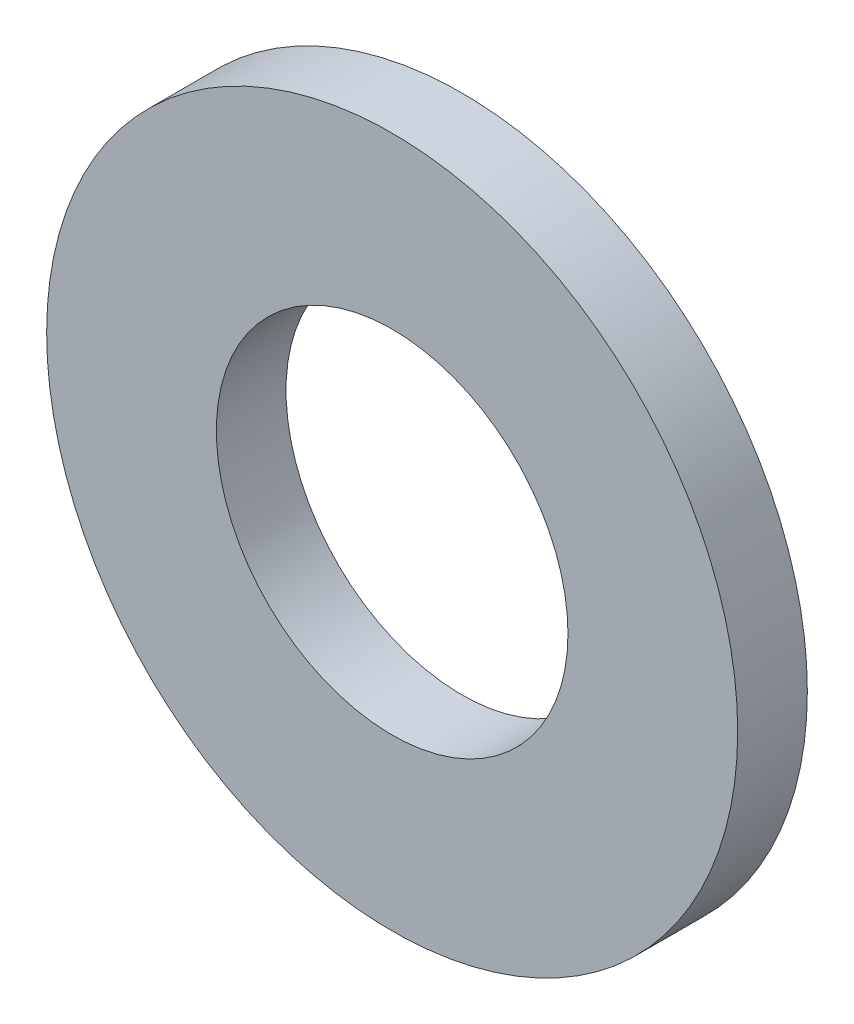
ISO-10303-21;
HEADER;
FILE_DESCRIPTION(('STEP AP214'),'2;1');
FILE_NAME('part.step','',(''),(''),'','','');
FILE_SCHEMA(('AUTOMOTIVE_DESIGN { 1 0 10303 214 1 1 1 1 }'));
ENDSEC;
DATA;
#1=APPLICATION_CONTEXT('core data for automotive mechanical design processes');
#2=APPLICATION_PROTOCOL_DEFINITION('international standard','automotive_design',2000,#1);
#3=PRODUCT_CONTEXT('',#1,'mechanical');
#4=PRODUCT('Part','Part','',(#3));
#5=PRODUCT_RELATED_PRODUCT_CATEGORY('part','',(#4));
#6=PRODUCT_DEFINITION_FORMATION('','',#4);
#7=PRODUCT_DEFINITION_CONTEXT('part definition',#1,'design');
#8=PRODUCT_DEFINITION('design','',#6,#7);
#9=PRODUCT_DEFINITION_SHAPE('','',#8);
#10=(LENGTH_UNIT() NAMED_UNIT(*) SI_UNIT(.MILLI.,.METRE.));
#11=(NAMED_UNIT(*) PLANE_ANGLE_UNIT() SI_UNIT($,.RADIAN.));
#12=(NAMED_UNIT(*) SI_UNIT($,.STERADIAN.) SOLID_ANGLE_UNIT());
#13=UNCERTAINTY_MEASURE_WITH_UNIT(LENGTH_MEASURE(1.E-05),#10,'distance_accuracy_value','');
#14=(GEOMETRIC_REPRESENTATION_CONTEXT(3) GLOBAL_UNCERTAINTY_ASSIGNED_CONTEXT((#13)) GLOBAL_UNIT_ASSIGNED_CONTEXT((#10,
#11,#12)) REPRESENTATION_CONTEXT('',''));
#15=CARTESIAN_POINT('',(0.,0.,0.));
#16=DIRECTION('',(0.,0.,1.));
#17=DIRECTION('',(1.,0.,0.));
#18=AXIS2_PLACEMENT_3D('',#15,#16,#17);
#19=CARTESIAN_POINT('',(0.,0.,1.6002));
#20=DIRECTION('',(0.,0.,1.));
#21=DIRECTION('',(1.,0.,0.));
#22=AXIS2_PLACEMENT_3D('',#19,#20,#21);
#23=PLANE('',#22);
#24=CARTESIAN_POINT('',(0.,0.,1.6002));
#25=DIRECTION('',(0.,0.,1.));
#26=DIRECTION('',(1.,0.,0.));
#27=AXIS2_PLACEMENT_3D('',#24,#25,#26);
#28=CIRCLE('',#27,7.9375);
#29=CARTESIAN_POINT('',(7.9375,0.,1.6002));
#30=VERTEX_POINT('',#29);
#31=EDGE_CURVE('E10',#30,#30,#28,.T.);
#32=ORIENTED_EDGE('',*,*,#31,.T.);
#33=EDGE_LOOP('',(#32));
#34=FACE_BOUND('',#33,.T.);
#35=CARTESIAN_POINT('',(0.,0.,1.6002));
#36=DIRECTION('',(0.,0.,1.));
#37=DIRECTION('',(1.,0.,0.));
#38=AXIS2_PLACEMENT_3D('',#35,#36,#37);
#39=CIRCLE('',#38,4.0386);
#40=CARTESIAN_POINT('',(4.0386,0.,1.6002));
#41=VERTEX_POINT('',#40);
#42=EDGE_CURVE('E42',#41,#41,#39,.T.);
#43=ORIENTED_EDGE('',*,*,#42,.F.);
#44=EDGE_LOOP('',(#43));
#45=FACE_BOUND('',#44,.T.);
#46=ADVANCED_FACE('F31',(#34,#45),#23,.T.);
#47=CARTESIAN_POINT('',(0.,0.,0.));
#48=DIRECTION('',(0.,0.,1.));
#49=DIRECTION('',(1.,0.,0.));
#50=AXIS2_PLACEMENT_3D('',#47,#48,#49);
#51=PLANE('',#50);
#52=CARTESIAN_POINT('',(0.,0.,0.));
#53=DIRECTION('',(0.,0.,1.));
#54=DIRECTION('',(1.,0.,0.));
#55=AXIS2_PLACEMENT_3D('',#52,#53,#54);
#56=CIRCLE('',#55,7.9375);
#57=CARTESIAN_POINT('',(7.9375,0.,0.));
#58=VERTEX_POINT('',#57);
#59=EDGE_CURVE('E35',#58,#58,#56,.T.);
#60=ORIENTED_EDGE('',*,*,#59,.F.);
#61=EDGE_LOOP('',(#60));
#62=FACE_BOUND('',#61,.T.);
#63=CARTESIAN_POINT('',(0.,0.,0.));
#64=DIRECTION('',(0.,0.,1.));
#65=DIRECTION('',(1.,0.,0.));
#66=AXIS2_PLACEMENT_3D('',#63,#64,#65);
#67=CIRCLE('',#66,4.0386);
#68=CARTESIAN_POINT('',(4.0386,0.,0.));
#69=VERTEX_POINT('',#68);
#70=EDGE_CURVE('E44',#69,#69,#67,.T.);
#71=ORIENTED_EDGE('',*,*,#70,.T.);
#72=EDGE_LOOP('',(#71));
#73=FACE_BOUND('',#72,.T.);
#74=ADVANCED_FACE('F54',(#62,#73),#51,.F.);
#75=CARTESIAN_POINT('',(0.,0.,1.6002));
#76=DIRECTION('',(0.,0.,-1.));
#77=DIRECTION('',(-1.,0.,0.));
#78=AXIS2_PLACEMENT_3D('',#75,#76,#77);
#79=CYLINDRICAL_SURFACE('',#78,7.9375);
#80=ORIENTED_EDGE('',*,*,#31,.F.);
#81=EDGE_LOOP('',(#80));
#82=FACE_BOUND('',#81,.T.);
#83=ORIENTED_EDGE('',*,*,#59,.T.);
#84=EDGE_LOOP('',(#83));
#85=FACE_BOUND('',#84,.T.);
#86=ADVANCED_FACE('F33',(#82,#85),#79,.T.);
#87=CARTESIAN_POINT('',(0.,0.,1.6002));
#88=DIRECTION('',(0.,0.,-1.));
#89=DIRECTION('',(-1.,0.,0.));
#90=AXIS2_PLACEMENT_3D('',#87,#88,#89);
#91=CYLINDRICAL_SURFACE('',#90,4.0386);
#92=ORIENTED_EDGE('',*,*,#42,.T.);
#93=EDGE_LOOP('',(#92));
#94=FACE_BOUND('',#93,.T.);
#95=ORIENTED_EDGE('',*,*,#70,.F.);
#96=EDGE_LOOP('',(#95));
#97=FACE_BOUND('',#96,.T.);
#98=ADVANCED_FACE('F50',(#94,#97),#91,.F.);
#99=CLOSED_SHELL('',(#46,#74,#86,#98));
#100=MANIFOLD_SOLID_BREP('B2',#99);
#101=ADVANCED_BREP_SHAPE_REPRESENTATION('',(#18,#100),#14);
#102=SHAPE_DEFINITION_REPRESENTATION(#9,#101);
ENDSEC;
END-ISO-10303-21;
